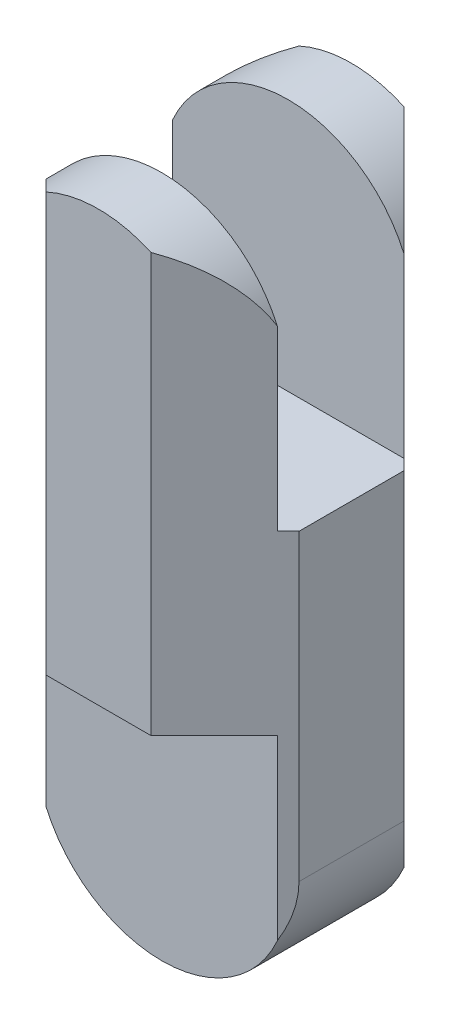
ISO-10303-21;
HEADER;
FILE_DESCRIPTION(('STEP AP214'),'2;1');
FILE_NAME('part.step','',(''),(''),'','','');
FILE_SCHEMA(('AUTOMOTIVE_DESIGN { 1 0 10303 214 1 1 1 1 }'));
ENDSEC;
DATA;
#1=APPLICATION_CONTEXT('core data for automotive mechanical design processes');
#2=APPLICATION_PROTOCOL_DEFINITION('international standard','automotive_design',2000,#1);
#3=PRODUCT_CONTEXT('',#1,'mechanical');
#4=PRODUCT('Part','Part','',(#3));
#5=PRODUCT_RELATED_PRODUCT_CATEGORY('part','',(#4));
#6=PRODUCT_DEFINITION_FORMATION('','',#4);
#7=PRODUCT_DEFINITION_CONTEXT('part definition',#1,'design');
#8=PRODUCT_DEFINITION('design','',#6,#7);
#9=PRODUCT_DEFINITION_SHAPE('','',#8);
#10=(LENGTH_UNIT() NAMED_UNIT(*) SI_UNIT(.MILLI.,.METRE.));
#11=(NAMED_UNIT(*) PLANE_ANGLE_UNIT() SI_UNIT($,.RADIAN.));
#12=(NAMED_UNIT(*) SI_UNIT($,.STERADIAN.) SOLID_ANGLE_UNIT());
#13=UNCERTAINTY_MEASURE_WITH_UNIT(LENGTH_MEASURE(1.E-05),#10,'distance_accuracy_value','');
#14=(GEOMETRIC_REPRESENTATION_CONTEXT(3) GLOBAL_UNCERTAINTY_ASSIGNED_CONTEXT((#13)) GLOBAL_UNIT_ASSIGNED_CONTEXT((#10,
#11,#12)) REPRESENTATION_CONTEXT('',''));
#15=CARTESIAN_POINT('',(0.,0.,0.));
#16=DIRECTION('',(0.,0.,1.));
#17=DIRECTION('',(1.,0.,0.));
#18=AXIS2_PLACEMENT_3D('',#15,#16,#17);
#19=CARTESIAN_POINT('',(4.14213562373094,54.,-10.));
#20=DIRECTION('',(0.,0.,1.));
#21=DIRECTION('',(1.,0.,0.));
#22=AXIS2_PLACEMENT_3D('',#19,#20,#21);
#23=PLANE('',#22);
#24=DIRECTION('',(0.,-1.,0.));
#25=VECTOR('',#24,1.);
#26=CARTESIAN_POINT('',(-4.14213562373096,54.,-10.));
#27=LINE('',#26,#25);
#28=CARTESIAN_POINT('',(-4.14213562373096,53.1017972112445,-10.));
#29=VERTEX_POINT('',#28);
#30=CARTESIAN_POINT('',(-4.14213562373096,20.,-10.));
#31=VERTEX_POINT('',#30);
#32=EDGE_CURVE('E186',#29,#31,#27,.T.);
#33=ORIENTED_EDGE('',*,*,#32,.F.);
#34=CARTESIAN_POINT('',(0.,44.,-10.));
#35=DIRECTION('',(0.,0.,1.));
#36=DIRECTION('',(1.,0.,0.));
#37=AXIS2_PLACEMENT_3D('',#34,#35,#36);
#38=CIRCLE('',#37,10.);
#39=CARTESIAN_POINT('',(4.14213562373094,53.1017972112445,-10.));
#40=VERTEX_POINT('',#39);
#41=EDGE_CURVE('E343',#29,#40,#38,.F.);
#42=ORIENTED_EDGE('',*,*,#41,.T.);
#43=DIRECTION('',(0.,-1.,0.));
#44=VECTOR('',#43,1.);
#45=CARTESIAN_POINT('',(4.14213562373094,54.,-10.));
#46=LINE('',#45,#44);
#47=CARTESIAN_POINT('',(4.14213562373094,20.,-10.));
#48=VERTEX_POINT('',#47);
#49=EDGE_CURVE('E189',#40,#48,#46,.T.);
#50=ORIENTED_EDGE('',*,*,#49,.T.);
#51=DIRECTION('',(1.,0.,0.));
#52=VECTOR('',#51,1.);
#53=CARTESIAN_POINT('',(10.,20.,-10.));
#54=LINE('',#53,#52);
#55=EDGE_CURVE('E261',#31,#48,#54,.T.);
#56=ORIENTED_EDGE('',*,*,#55,.F.);
#57=EDGE_LOOP('',(#33,#42,#50,#56));
#58=FACE_BOUND('',#57,.T.);
#59=ADVANCED_FACE('F39',(#58),#23,.F.);
#60=CARTESIAN_POINT('',(-4.14213562373096,54.,10.));
#61=DIRECTION('',(0.,0.,-1.));
#62=DIRECTION('',(-1.,0.,0.));
#63=AXIS2_PLACEMENT_3D('',#60,#61,#62);
#64=PLANE('',#63);
#65=DIRECTION('',(0.,-1.,0.));
#66=VECTOR('',#65,1.);
#67=CARTESIAN_POINT('',(4.14213562373096,54.,10.));
#68=LINE('',#67,#66);
#69=CARTESIAN_POINT('',(4.14213562373096,53.1017972112445,10.));
#70=VERTEX_POINT('',#69);
#71=CARTESIAN_POINT('',(4.14213562373096,20.,10.));
#72=VERTEX_POINT('',#71);
#73=EDGE_CURVE('E166',#70,#72,#68,.T.);
#74=ORIENTED_EDGE('',*,*,#73,.F.);
#75=CARTESIAN_POINT('',(0.,44.,10.));
#76=DIRECTION('',(0.,0.,-1.));
#77=DIRECTION('',(1.,0.,0.));
#78=AXIS2_PLACEMENT_3D('',#75,#76,#77);
#79=CIRCLE('',#78,10.);
#80=CARTESIAN_POINT('',(-4.14213562373096,53.1017972112445,10.));
#81=VERTEX_POINT('',#80);
#82=EDGE_CURVE('E153',#81,#70,#79,.T.);
#83=ORIENTED_EDGE('',*,*,#82,.F.);
#84=DIRECTION('',(0.,-1.,0.));
#85=VECTOR('',#84,1.);
#86=CARTESIAN_POINT('',(-4.14213562373096,54.,10.));
#87=LINE('',#86,#85);
#88=CARTESIAN_POINT('',(-4.14213562373096,20.,10.));
#89=VERTEX_POINT('',#88);
#90=EDGE_CURVE('E164',#81,#89,#87,.T.);
#91=ORIENTED_EDGE('',*,*,#90,.T.);
#92=DIRECTION('',(-1.,0.,0.));
#93=VECTOR('',#92,1.);
#94=CARTESIAN_POINT('',(-10.,20.,10.));
#95=LINE('',#94,#93);
#96=EDGE_CURVE('E278',#72,#89,#95,.T.);
#97=ORIENTED_EDGE('',*,*,#96,.F.);
#98=EDGE_LOOP('',(#74,#83,#91,#97));
#99=FACE_BOUND('',#98,.T.);
#100=ADVANCED_FACE('F162',(#99),#64,.F.);
#101=CARTESIAN_POINT('',(10.,54.,-4.14213562373095));
#102=DIRECTION('',(-0.707106781186547,0.,0.707106781186548));
#103=DIRECTION('',(0.707106781186548,0.,0.707106781186547));
#104=AXIS2_PLACEMENT_3D('',#101,#102,#103);
#105=PLANE('',#104);
#106=ORIENTED_EDGE('',*,*,#49,.F.);
#107=CARTESIAN_POINT('',(0.,44.,-14.1421356237309));
#108=DIRECTION('',(-0.707106781186547,0.,0.707106781186548));
#109=DIRECTION('',(0.707106781186548,0.,0.707106781186547));
#110=AXIS2_PLACEMENT_3D('',#107,#108,#109);
#111=ELLIPSE('',#110,14.1421356237309,10.);
#112=CARTESIAN_POINT('',(9.14213562373095,48.0523272618718,-5.));
#113=VERTEX_POINT('',#112);
#114=EDGE_CURVE('E339',#40,#113,#111,.F.);
#115=ORIENTED_EDGE('',*,*,#114,.T.);
#116=DIRECTION('',(0.,1.,0.));
#117=VECTOR('',#116,1.);
#118=CARTESIAN_POINT('',(9.14213562373095,54.,-5.));
#119=LINE('',#118,#117);
#120=CARTESIAN_POINT('',(9.14213562373095,34.,-5.));
#121=VERTEX_POINT('',#120);
#122=EDGE_CURVE('E246',#121,#113,#119,.T.);
#123=ORIENTED_EDGE('',*,*,#122,.F.);
#124=DIRECTION('',(0.707106781186548,0.,0.707106781186547));
#125=VECTOR('',#124,1.);
#126=CARTESIAN_POINT('',(10.,34.,-4.14213562373095));
#127=LINE('',#126,#125);
#128=CARTESIAN_POINT('',(10.,34.,-4.14213562373095));
#129=VERTEX_POINT('',#128);
#130=EDGE_CURVE('E258',#121,#129,#127,.T.);
#131=ORIENTED_EDGE('',*,*,#130,.T.);
#132=DIRECTION('',(0.,-1.,0.));
#133=VECTOR('',#132,1.);
#134=CARTESIAN_POINT('',(10.,54.,-4.14213562373095));
#135=LINE('',#134,#133);
#136=CARTESIAN_POINT('',(10.,10.,-4.14213562373095));
#137=VERTEX_POINT('',#136);
#138=EDGE_CURVE('E192',#129,#137,#135,.T.);
#139=ORIENTED_EDGE('',*,*,#138,.T.);
#140=CARTESIAN_POINT('',(0.,10.,-14.1421356237309));
#141=DIRECTION('',(-0.707106781186547,0.,0.707106781186548));
#142=DIRECTION('',(0.707106781186548,0.,0.707106781186547));
#143=AXIS2_PLACEMENT_3D('',#140,#141,#142);
#144=ELLIPSE('',#143,14.1421356237309,10.);
#145=CARTESIAN_POINT('',(9.14213562373095,5.94767273812816,-5.00000000000001));
#146=VERTEX_POINT('',#145);
#147=EDGE_CURVE('E312',#137,#146,#144,.F.);
#148=ORIENTED_EDGE('',*,*,#147,.T.);
#149=DIRECTION('',(0.,-1.,0.));
#150=VECTOR('',#149,1.);
#151=CARTESIAN_POINT('',(9.14213562373095,54.,-5.00000000000001));
#152=LINE('',#151,#150);
#153=CARTESIAN_POINT('',(9.14213562373095,20.,-5.00000000000001));
#154=VERTEX_POINT('',#153);
#155=EDGE_CURVE('E268',#154,#146,#152,.T.);
#156=ORIENTED_EDGE('',*,*,#155,.F.);
#157=DIRECTION('',(-0.707106781186548,0.,-0.707106781186547));
#158=VECTOR('',#157,1.);
#159=CARTESIAN_POINT('',(10.,20.,-4.14213562373095));
#160=LINE('',#159,#158);
#161=EDGE_CURVE('E274',#154,#48,#160,.T.);
#162=ORIENTED_EDGE('',*,*,#161,.T.);
#163=EDGE_LOOP('',(#106,#115,#123,#131,#139,#148,#156,#162));
#164=FACE_BOUND('',#163,.T.);
#165=ADVANCED_FACE('F320',(#164),#105,.F.);
#166=CARTESIAN_POINT('',(-4.14213562373096,54.,-10.));
#167=DIRECTION('',(0.707106781186548,0.,0.707106781186547));
#168=DIRECTION('',(0.707106781186547,0.,-0.707106781186548));
#169=AXIS2_PLACEMENT_3D('',#166,#167,#168);
#170=PLANE('',#169);
#171=DIRECTION('',(0.,-1.,0.));
#172=VECTOR('',#171,1.);
#173=CARTESIAN_POINT('',(-9.14213562373095,54.,-5.));
#174=LINE('',#173,#172);
#175=CARTESIAN_POINT('',(-9.14213562373095,48.0523272618718,-5.));
#176=VERTEX_POINT('',#175);
#177=CARTESIAN_POINT('',(-9.14213562373095,34.,-5.));
#178=VERTEX_POINT('',#177);
#179=EDGE_CURVE('E243',#176,#178,#174,.T.);
#180=ORIENTED_EDGE('',*,*,#179,.F.);
#181=CARTESIAN_POINT('',(0.,44.,-14.142135623731));
#182=DIRECTION('',(0.707106781186548,0.,0.707106781186547));
#183=DIRECTION('',(-0.707106781186547,0.,0.707106781186548));
#184=AXIS2_PLACEMENT_3D('',#181,#182,#183);
#185=ELLIPSE('',#184,14.1421356237309,10.);
#186=EDGE_CURVE('E350',#176,#29,#185,.F.);
#187=ORIENTED_EDGE('',*,*,#186,.T.);
#188=ORIENTED_EDGE('',*,*,#32,.T.);
#189=DIRECTION('',(-0.707106781186547,0.,0.707106781186548));
#190=VECTOR('',#189,1.);
#191=CARTESIAN_POINT('',(-4.14213562373096,20.,-10.));
#192=LINE('',#191,#190);
#193=CARTESIAN_POINT('',(-9.14213562373096,20.,-5.));
#194=VERTEX_POINT('',#193);
#195=EDGE_CURVE('E205',#31,#194,#192,.T.);
#196=ORIENTED_EDGE('',*,*,#195,.T.);
#197=DIRECTION('',(0.,1.,0.));
#198=VECTOR('',#197,1.);
#199=CARTESIAN_POINT('',(-9.14213562373095,54.,-5.));
#200=LINE('',#199,#198);
#201=CARTESIAN_POINT('',(-9.14213562373095,5.94767273812822,-5.));
#202=VERTEX_POINT('',#201);
#203=EDGE_CURVE('E202',#202,#194,#200,.T.);
#204=ORIENTED_EDGE('',*,*,#203,.F.);
#205=CARTESIAN_POINT('',(0.,10.,-14.142135623731));
#206=DIRECTION('',(0.707106781186548,0.,0.707106781186547));
#207=DIRECTION('',(-0.707106781186547,0.,0.707106781186548));
#208=AXIS2_PLACEMENT_3D('',#205,#206,#207);
#209=ELLIPSE('',#208,14.142135623731,10.);
#210=CARTESIAN_POINT('',(-10.,10.,-4.14213562373095));
#211=VERTEX_POINT('',#210);
#212=EDGE_CURVE('E298',#202,#211,#209,.F.);
#213=ORIENTED_EDGE('',*,*,#212,.T.);
#214=DIRECTION('',(0.,-1.,0.));
#215=VECTOR('',#214,1.);
#216=CARTESIAN_POINT('',(-10.,54.,-4.14213562373095));
#217=LINE('',#216,#215);
#218=CARTESIAN_POINT('',(-10.,34.,-4.14213562373095));
#219=VERTEX_POINT('',#218);
#220=EDGE_CURVE('E178',#219,#211,#217,.T.);
#221=ORIENTED_EDGE('',*,*,#220,.F.);
#222=DIRECTION('',(0.707106781186547,0.,-0.707106781186548));
#223=VECTOR('',#222,1.);
#224=CARTESIAN_POINT('',(-4.14213562373096,34.,-10.));
#225=LINE('',#224,#223);
#226=EDGE_CURVE('E254',#219,#178,#225,.T.);
#227=ORIENTED_EDGE('',*,*,#226,.T.);
#228=EDGE_LOOP('',(#180,#187,#188,#196,#204,#213,#221,#227));
#229=FACE_BOUND('',#228,.T.);
#230=ADVANCED_FACE('F330',(#229),#170,.F.);
#231=CARTESIAN_POINT('',(0.,0.,-5.));
#232=DIRECTION('',(0.,0.,1.));
#233=DIRECTION('',(1.,0.,0.));
#234=AXIS2_PLACEMENT_3D('',#231,#232,#233);
#235=PLANE('',#234);
#236=CARTESIAN_POINT('',(0.,44.,-5.));
#237=DIRECTION('',(0.,0.,1.));
#238=DIRECTION('',(1.,0.,0.));
#239=AXIS2_PLACEMENT_3D('',#236,#237,#238);
#240=CIRCLE('',#239,10.);
#241=EDGE_CURVE('E158',#176,#113,#240,.F.);
#242=ORIENTED_EDGE('',*,*,#241,.F.);
#243=ORIENTED_EDGE('',*,*,#179,.T.);
#244=DIRECTION('',(1.,0.,0.));
#245=VECTOR('',#244,1.);
#246=CARTESIAN_POINT('',(-10.,34.,-5.));
#247=LINE('',#246,#245);
#248=EDGE_CURVE('E236',#178,#121,#247,.T.);
#249=ORIENTED_EDGE('',*,*,#248,.T.);
#250=ORIENTED_EDGE('',*,*,#122,.T.);
#251=EDGE_LOOP('',(#242,#243,#249,#250));
#252=FACE_BOUND('',#251,.T.);
#253=ADVANCED_FACE('F357',(#252),#235,.T.);
#254=CARTESIAN_POINT('',(0.,0.,5.));
#255=DIRECTION('',(0.,0.,1.));
#256=DIRECTION('',(1.,0.,0.));
#257=AXIS2_PLACEMENT_3D('',#254,#255,#256);
#258=PLANE('',#257);
#259=DIRECTION('',(0.,-1.,0.));
#260=VECTOR('',#259,1.);
#261=CARTESIAN_POINT('',(-9.14213562373096,54.,5.));
#262=LINE('',#261,#260);
#263=CARTESIAN_POINT('',(-9.14213562373096,48.0523272618718,5.));
#264=VERTEX_POINT('',#263);
#265=CARTESIAN_POINT('',(-9.14213562373096,34.,5.));
#266=VERTEX_POINT('',#265);
#267=EDGE_CURVE('E234',#264,#266,#262,.T.);
#268=ORIENTED_EDGE('',*,*,#267,.F.);
#269=CARTESIAN_POINT('',(0.,44.,5.));
#270=DIRECTION('',(0.,0.,1.));
#271=DIRECTION('',(1.,0.,0.));
#272=AXIS2_PLACEMENT_3D('',#269,#270,#271);
#273=CIRCLE('',#272,10.);
#274=CARTESIAN_POINT('',(9.14213562373096,48.0523272618718,5.));
#275=VERTEX_POINT('',#274);
#276=EDGE_CURVE('E11',#264,#275,#273,.F.);
#277=ORIENTED_EDGE('',*,*,#276,.T.);
#278=DIRECTION('',(0.,1.,0.));
#279=VECTOR('',#278,1.);
#280=CARTESIAN_POINT('',(9.14213562373096,54.,5.));
#281=LINE('',#280,#279);
#282=CARTESIAN_POINT('',(9.14213562373096,34.,5.));
#283=VERTEX_POINT('',#282);
#284=EDGE_CURVE('E214',#283,#275,#281,.T.);
#285=ORIENTED_EDGE('',*,*,#284,.F.);
#286=DIRECTION('',(1.,0.,0.));
#287=VECTOR('',#286,1.);
#288=CARTESIAN_POINT('',(-10.,34.,5.));
#289=LINE('',#288,#287);
#290=EDGE_CURVE('E225',#266,#283,#289,.T.);
#291=ORIENTED_EDGE('',*,*,#290,.F.);
#292=EDGE_LOOP('',(#268,#277,#285,#291));
#293=FACE_BOUND('',#292,.T.);
#294=ADVANCED_FACE('F376',(#293),#258,.F.);
#295=CARTESIAN_POINT('',(0.,10.,-56.));
#296=DIRECTION('',(0.,0.,1.));
#297=DIRECTION('',(1.,0.,0.));
#298=AXIS2_PLACEMENT_3D('',#295,#296,#297);
#299=CYLINDRICAL_SURFACE('',#298,10.);
#300=CARTESIAN_POINT('',(0.,10.,-5.));
#301=DIRECTION('',(0.,0.,-1.));
#302=DIRECTION('',(-1.,0.,0.));
#303=AXIS2_PLACEMENT_3D('',#300,#301,#302);
#304=CIRCLE('',#303,10.);
#305=EDGE_CURVE('E62',#146,#202,#304,.T.);
#306=ORIENTED_EDGE('',*,*,#305,.F.);
#307=ORIENTED_EDGE('',*,*,#147,.F.);
#308=DIRECTION('',(0.,0.,1.));
#309=VECTOR('',#308,1.);
#310=CARTESIAN_POINT('',(10.,10.,-56.));
#311=LINE('',#310,#309);
#312=CARTESIAN_POINT('',(10.,10.,4.14213562373095));
#313=VERTEX_POINT('',#312);
#314=EDGE_CURVE('E294',#137,#313,#311,.T.);
#315=ORIENTED_EDGE('',*,*,#314,.T.);
#316=CARTESIAN_POINT('',(0.,10.,14.1421356237309));
#317=DIRECTION('',(-0.707106781186547,0.,-0.707106781186548));
#318=DIRECTION('',(-0.707106781186548,0.,0.707106781186547));
#319=AXIS2_PLACEMENT_3D('',#316,#317,#318);
#320=ELLIPSE('',#319,14.1421356237309,10.);
#321=CARTESIAN_POINT('',(9.14213562373095,5.94767273812818,5.));
#322=VERTEX_POINT('',#321);
#323=EDGE_CURVE('E305',#322,#313,#320,.F.);
#324=ORIENTED_EDGE('',*,*,#323,.F.);
#325=CARTESIAN_POINT('',(0.,10.,5.));
#326=DIRECTION('',(0.,0.,1.));
#327=DIRECTION('',(1.,0.,0.));
#328=AXIS2_PLACEMENT_3D('',#325,#326,#327);
#329=CIRCLE('',#328,10.);
#330=CARTESIAN_POINT('',(-9.14213562373095,5.94767273812819,5.00000000000001));
#331=VERTEX_POINT('',#330);
#332=EDGE_CURVE('E195',#331,#322,#329,.T.);
#333=ORIENTED_EDGE('',*,*,#332,.F.);
#334=CARTESIAN_POINT('',(0.,10.,14.142135623731));
#335=DIRECTION('',(0.707106781186548,0.,-0.707106781186547));
#336=DIRECTION('',(0.707106781186547,0.,0.707106781186548));
#337=AXIS2_PLACEMENT_3D('',#334,#335,#336);
#338=ELLIPSE('',#337,14.142135623731,10.);
#339=CARTESIAN_POINT('',(-10.,10.,4.14213562373096));
#340=VERTEX_POINT('',#339);
#341=EDGE_CURVE('E308',#340,#331,#338,.F.);
#342=ORIENTED_EDGE('',*,*,#341,.F.);
#343=DIRECTION('',(0.,0.,1.));
#344=VECTOR('',#343,1.);
#345=CARTESIAN_POINT('',(-10.,10.,-56.));
#346=LINE('',#345,#344);
#347=EDGE_CURVE('E293',#211,#340,#346,.T.);
#348=ORIENTED_EDGE('',*,*,#347,.F.);
#349=ORIENTED_EDGE('',*,*,#212,.F.);
#350=EDGE_LOOP('',(#306,#307,#315,#324,#333,#342,#348,#349));
#351=FACE_BOUND('',#350,.T.);
#352=ADVANCED_FACE('F322',(#351),#299,.T.);
#353=CARTESIAN_POINT('',(-10.,54.,-4.14213562373095));
#354=DIRECTION('',(1.,0.,0.));
#355=DIRECTION('',(0.,0.,-1.));
#356=AXIS2_PLACEMENT_3D('',#353,#354,#355);
#357=PLANE('',#356);
#358=DIRECTION('',(0.,-1.,0.));
#359=VECTOR('',#358,1.);
#360=CARTESIAN_POINT('',(-10.,54.,4.14213562373096));
#361=LINE('',#360,#359);
#362=CARTESIAN_POINT('',(-10.,34.,4.14213562373096));
#363=VERTEX_POINT('',#362);
#364=EDGE_CURVE('E174',#363,#340,#361,.T.);
#365=ORIENTED_EDGE('',*,*,#364,.F.);
#366=DIRECTION('',(0.,0.,1.));
#367=VECTOR('',#366,1.);
#368=CARTESIAN_POINT('',(-10.,34.,-5.));
#369=LINE('',#368,#367);
#370=EDGE_CURVE('E230',#219,#363,#369,.T.);
#371=ORIENTED_EDGE('',*,*,#370,.F.);
#372=ORIENTED_EDGE('',*,*,#220,.T.);
#373=ORIENTED_EDGE('',*,*,#347,.T.);
#374=EDGE_LOOP('',(#365,#371,#372,#373));
#375=FACE_BOUND('',#374,.T.);
#376=ADVANCED_FACE('F374',(#375),#357,.F.);
#377=CARTESIAN_POINT('',(10.,54.,4.14213562373095));
#378=DIRECTION('',(-1.,0.,0.));
#379=DIRECTION('',(0.,0.,1.));
#380=AXIS2_PLACEMENT_3D('',#377,#378,#379);
#381=PLANE('',#380);
#382=ORIENTED_EDGE('',*,*,#138,.F.);
#383=DIRECTION('',(0.,0.,1.));
#384=VECTOR('',#383,1.);
#385=CARTESIAN_POINT('',(10.,34.,-5.));
#386=LINE('',#385,#384);
#387=CARTESIAN_POINT('',(10.,34.,4.14213562373096));
#388=VERTEX_POINT('',#387);
#389=EDGE_CURVE('E221',#129,#388,#386,.T.);
#390=ORIENTED_EDGE('',*,*,#389,.T.);
#391=DIRECTION('',(0.,-1.,0.));
#392=VECTOR('',#391,1.);
#393=CARTESIAN_POINT('',(10.,54.,4.14213562373095));
#394=LINE('',#393,#392);
#395=EDGE_CURVE('E180',#388,#313,#394,.T.);
#396=ORIENTED_EDGE('',*,*,#395,.T.);
#397=ORIENTED_EDGE('',*,*,#314,.F.);
#398=EDGE_LOOP('',(#382,#390,#396,#397));
#399=FACE_BOUND('',#398,.T.);
#400=ADVANCED_FACE('F41',(#399),#381,.F.);
#401=CARTESIAN_POINT('',(-10.,54.,4.14213562373096));
#402=DIRECTION('',(0.707106781186548,0.,-0.707106781186547));
#403=DIRECTION('',(-0.707106781186547,0.,-0.707106781186548));
#404=AXIS2_PLACEMENT_3D('',#401,#402,#403);
#405=PLANE('',#404);
#406=ORIENTED_EDGE('',*,*,#90,.F.);
#407=CARTESIAN_POINT('',(0.,44.,14.142135623731));
#408=DIRECTION('',(0.707106781186548,0.,-0.707106781186547));
#409=DIRECTION('',(0.707106781186547,0.,0.707106781186548));
#410=AXIS2_PLACEMENT_3D('',#407,#408,#409);
#411=ELLIPSE('',#410,14.142135623731,10.);
#412=EDGE_CURVE('E150',#81,#264,#411,.F.);
#413=ORIENTED_EDGE('',*,*,#412,.T.);
#414=ORIENTED_EDGE('',*,*,#267,.T.);
#415=DIRECTION('',(-0.707106781186547,0.,-0.707106781186548));
#416=VECTOR('',#415,1.);
#417=CARTESIAN_POINT('',(-10.,34.,4.14213562373096));
#418=LINE('',#417,#416);
#419=EDGE_CURVE('E250',#266,#363,#418,.T.);
#420=ORIENTED_EDGE('',*,*,#419,.T.);
#421=ORIENTED_EDGE('',*,*,#364,.T.);
#422=ORIENTED_EDGE('',*,*,#341,.T.);
#423=DIRECTION('',(0.,-1.,0.));
#424=VECTOR('',#423,1.);
#425=CARTESIAN_POINT('',(-9.14213562373095,54.,5.));
#426=LINE('',#425,#424);
#427=CARTESIAN_POINT('',(-9.14213562373095,20.,5.));
#428=VERTEX_POINT('',#427);
#429=EDGE_CURVE('E288',#428,#331,#426,.T.);
#430=ORIENTED_EDGE('',*,*,#429,.F.);
#431=DIRECTION('',(0.707106781186547,0.,0.707106781186548));
#432=VECTOR('',#431,1.);
#433=CARTESIAN_POINT('',(-10.,20.,4.14213562373096));
#434=LINE('',#433,#432);
#435=EDGE_CURVE('E172',#428,#89,#434,.T.);
#436=ORIENTED_EDGE('',*,*,#435,.T.);
#437=EDGE_LOOP('',(#406,#413,#414,#420,#421,#422,#430,#436));
#438=FACE_BOUND('',#437,.T.);
#439=ADVANCED_FACE('F170',(#438),#405,.F.);
#440=CARTESIAN_POINT('',(4.14213562373096,54.,10.));
#441=DIRECTION('',(-0.707106781186547,0.,-0.707106781186548));
#442=DIRECTION('',(-0.707106781186548,0.,0.707106781186547));
#443=AXIS2_PLACEMENT_3D('',#440,#441,#442);
#444=PLANE('',#443);
#445=ORIENTED_EDGE('',*,*,#284,.T.);
#446=CARTESIAN_POINT('',(0.,44.,14.1421356237309));
#447=DIRECTION('',(-0.707106781186547,0.,-0.707106781186548));
#448=DIRECTION('',(-0.707106781186548,0.,0.707106781186547));
#449=AXIS2_PLACEMENT_3D('',#446,#447,#448);
#450=ELLIPSE('',#449,14.1421356237309,10.);
#451=EDGE_CURVE('E55',#275,#70,#450,.F.);
#452=ORIENTED_EDGE('',*,*,#451,.T.);
#453=ORIENTED_EDGE('',*,*,#73,.T.);
#454=DIRECTION('',(0.707106781186548,0.,-0.707106781186547));
#455=VECTOR('',#454,1.);
#456=CARTESIAN_POINT('',(4.14213562373096,20.,10.));
#457=LINE('',#456,#455);
#458=CARTESIAN_POINT('',(9.14213562373096,20.,5.));
#459=VERTEX_POINT('',#458);
#460=EDGE_CURVE('E198',#72,#459,#457,.T.);
#461=ORIENTED_EDGE('',*,*,#460,.T.);
#462=DIRECTION('',(0.,1.,0.));
#463=VECTOR('',#462,1.);
#464=CARTESIAN_POINT('',(9.14213562373095,54.,5.));
#465=LINE('',#464,#463);
#466=EDGE_CURVE('E283',#322,#459,#465,.T.);
#467=ORIENTED_EDGE('',*,*,#466,.F.);
#468=ORIENTED_EDGE('',*,*,#323,.T.);
#469=ORIENTED_EDGE('',*,*,#395,.F.);
#470=DIRECTION('',(-0.707106781186548,0.,0.707106781186547));
#471=VECTOR('',#470,1.);
#472=CARTESIAN_POINT('',(4.14213562373096,34.,10.));
#473=LINE('',#472,#471);
#474=EDGE_CURVE('E48',#388,#283,#473,.T.);
#475=ORIENTED_EDGE('',*,*,#474,.T.);
#476=EDGE_LOOP('',(#445,#452,#453,#461,#467,#468,#469,#475));
#477=FACE_BOUND('',#476,.T.);
#478=ADVANCED_FACE('F213',(#477),#444,.F.);
#479=CARTESIAN_POINT('',(-10.,20.,5.));
#480=DIRECTION('',(0.,1.,0.));
#481=DIRECTION('',(0.,0.,1.));
#482=AXIS2_PLACEMENT_3D('',#479,#480,#481);
#483=PLANE('',#482);
#484=DIRECTION('',(-1.,0.,0.));
#485=VECTOR('',#484,1.);
#486=CARTESIAN_POINT('',(-10.,20.,5.));
#487=LINE('',#486,#485);
#488=EDGE_CURVE('E279',#459,#428,#487,.T.);
#489=ORIENTED_EDGE('',*,*,#488,.F.);
#490=ORIENTED_EDGE('',*,*,#460,.F.);
#491=ORIENTED_EDGE('',*,*,#96,.T.);
#492=ORIENTED_EDGE('',*,*,#435,.F.);
#493=EDGE_LOOP('',(#489,#490,#491,#492));
#494=FACE_BOUND('',#493,.T.);
#495=ADVANCED_FACE('F368',(#494),#483,.F.);
#496=CARTESIAN_POINT('',(0.,10.,5.));
#497=DIRECTION('',(0.,0.,1.));
#498=DIRECTION('',(1.,0.,0.));
#499=AXIS2_PLACEMENT_3D('',#496,#497,#498);
#500=PLANE('',#499);
#501=ORIENTED_EDGE('',*,*,#429,.T.);
#502=ORIENTED_EDGE('',*,*,#332,.T.);
#503=ORIENTED_EDGE('',*,*,#466,.T.);
#504=ORIENTED_EDGE('',*,*,#488,.T.);
#505=EDGE_LOOP('',(#501,#502,#503,#504));
#506=FACE_BOUND('',#505,.T.);
#507=ADVANCED_FACE('F370',(#506),#500,.T.);
#508=CARTESIAN_POINT('',(10.,20.,-5.00000000000001));
#509=DIRECTION('',(0.,1.,0.));
#510=DIRECTION('',(0.,0.,1.));
#511=AXIS2_PLACEMENT_3D('',#508,#509,#510);
#512=PLANE('',#511);
#513=DIRECTION('',(1.,0.,0.));
#514=VECTOR('',#513,1.);
#515=CARTESIAN_POINT('',(10.,20.,-5.00000000000001));
#516=LINE('',#515,#514);
#517=EDGE_CURVE('E264',#194,#154,#516,.T.);
#518=ORIENTED_EDGE('',*,*,#517,.F.);
#519=ORIENTED_EDGE('',*,*,#195,.F.);
#520=ORIENTED_EDGE('',*,*,#55,.T.);
#521=ORIENTED_EDGE('',*,*,#161,.F.);
#522=EDGE_LOOP('',(#518,#519,#520,#521));
#523=FACE_BOUND('',#522,.T.);
#524=ADVANCED_FACE('F335',(#523),#512,.F.);
#525=CARTESIAN_POINT('',(0.,10.,-5.));
#526=DIRECTION('',(0.,0.,-1.));
#527=DIRECTION('',(-1.,0.,0.));
#528=AXIS2_PLACEMENT_3D('',#525,#526,#527);
#529=PLANE('',#528);
#530=ORIENTED_EDGE('',*,*,#155,.T.);
#531=ORIENTED_EDGE('',*,*,#305,.T.);
#532=ORIENTED_EDGE('',*,*,#203,.T.);
#533=ORIENTED_EDGE('',*,*,#517,.T.);
#534=EDGE_LOOP('',(#530,#531,#532,#533));
#535=FACE_BOUND('',#534,.T.);
#536=ADVANCED_FACE('F333',(#535),#529,.T.);
#537=CARTESIAN_POINT('',(-10.,34.,-5.));
#538=DIRECTION('',(0.,-1.,0.));
#539=DIRECTION('',(0.,0.,-1.));
#540=AXIS2_PLACEMENT_3D('',#537,#538,#539);
#541=PLANE('',#540);
#542=ORIENTED_EDGE('',*,*,#248,.F.);
#543=ORIENTED_EDGE('',*,*,#226,.F.);
#544=ORIENTED_EDGE('',*,*,#370,.T.);
#545=ORIENTED_EDGE('',*,*,#419,.F.);
#546=ORIENTED_EDGE('',*,*,#290,.T.);
#547=ORIENTED_EDGE('',*,*,#474,.F.);
#548=ORIENTED_EDGE('',*,*,#389,.F.);
#549=ORIENTED_EDGE('',*,*,#130,.F.);
#550=EDGE_LOOP('',(#542,#543,#544,#545,#546,#547,#548,#549));
#551=FACE_BOUND('',#550,.T.);
#552=ADVANCED_FACE('F220',(#551),#541,.F.);
#553=CARTESIAN_POINT('',(0.,44.,-20.));
#554=DIRECTION('',(0.,0.,1.));
#555=DIRECTION('',(1.,0.,0.));
#556=AXIS2_PLACEMENT_3D('',#553,#554,#555);
#557=CYLINDRICAL_SURFACE('',#556,10.);
#558=ORIENTED_EDGE('',*,*,#82,.T.);
#559=ORIENTED_EDGE('',*,*,#451,.F.);
#560=ORIENTED_EDGE('',*,*,#276,.F.);
#561=ORIENTED_EDGE('',*,*,#412,.F.);
#562=EDGE_LOOP('',(#558,#559,#560,#561));
#563=FACE_BOUND('',#562,.T.);
#564=ADVANCED_FACE('F152',(#563),#557,.T.);
#565=ORIENTED_EDGE('',*,*,#241,.T.);
#566=ORIENTED_EDGE('',*,*,#114,.F.);
#567=ORIENTED_EDGE('',*,*,#41,.F.);
#568=ORIENTED_EDGE('',*,*,#186,.F.);
#569=EDGE_LOOP('',(#565,#566,#567,#568));
#570=FACE_BOUND('',#569,.T.);
#571=ADVANCED_FACE('F438',(#570),#557,.T.);
#572=CLOSED_SHELL('',(#59,#100,#165,#230,#253,#294,#352,#376,#400,#439,#478,#495,#507,#524,#536,
#552,#564,#571));
#573=MANIFOLD_SOLID_BREP('B2',#572);
#574=ADVANCED_BREP_SHAPE_REPRESENTATION('',(#18,#573),#14);
#575=SHAPE_DEFINITION_REPRESENTATION(#9,#574);
ENDSEC;
END-ISO-10303-21;
